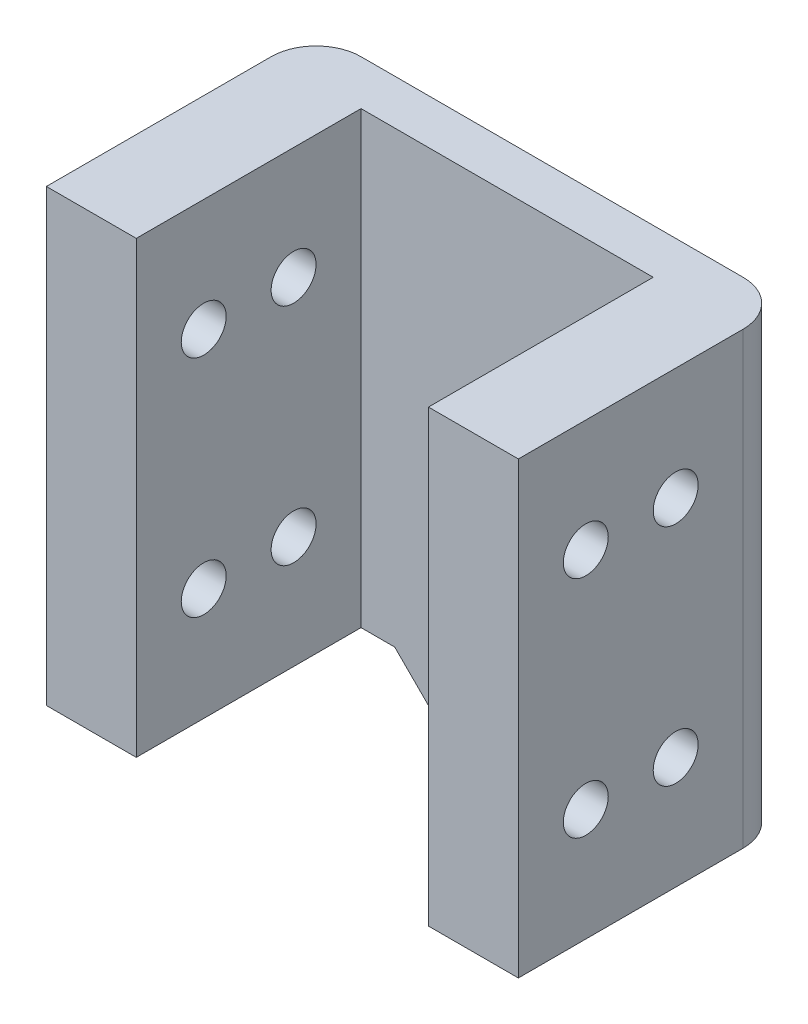
ISO-10303-21;
HEADER;
FILE_DESCRIPTION(('STEP AP214'),'2;1');
FILE_NAME('part.step','',(''),(''),'','','');
FILE_SCHEMA(('AUTOMOTIVE_DESIGN { 1 0 10303 214 1 1 1 1 }'));
ENDSEC;
DATA;
#1=APPLICATION_CONTEXT('core data for automotive mechanical design processes');
#2=APPLICATION_PROTOCOL_DEFINITION('international standard','automotive_design',2000,#1);
#3=PRODUCT_CONTEXT('',#1,'mechanical');
#4=PRODUCT('Part','Part','',(#3));
#5=PRODUCT_RELATED_PRODUCT_CATEGORY('part','',(#4));
#6=PRODUCT_DEFINITION_FORMATION('','',#4);
#7=PRODUCT_DEFINITION_CONTEXT('part definition',#1,'design');
#8=PRODUCT_DEFINITION('design','',#6,#7);
#9=PRODUCT_DEFINITION_SHAPE('','',#8);
#10=(LENGTH_UNIT() NAMED_UNIT(*) SI_UNIT(.MILLI.,.METRE.));
#11=(NAMED_UNIT(*) PLANE_ANGLE_UNIT() SI_UNIT($,.RADIAN.));
#12=(NAMED_UNIT(*) SI_UNIT($,.STERADIAN.) SOLID_ANGLE_UNIT());
#13=UNCERTAINTY_MEASURE_WITH_UNIT(LENGTH_MEASURE(1.E-05),#10,'distance_accuracy_value','');
#14=(GEOMETRIC_REPRESENTATION_CONTEXT(3) GLOBAL_UNCERTAINTY_ASSIGNED_CONTEXT((#13)) GLOBAL_UNIT_ASSIGNED_CONTEXT((#10,
#11,#12)) REPRESENTATION_CONTEXT('',''));
#15=CARTESIAN_POINT('',(0.,0.,0.));
#16=DIRECTION('',(0.,0.,1.));
#17=DIRECTION('',(1.,0.,0.));
#18=AXIS2_PLACEMENT_3D('',#15,#16,#17);
#19=CARTESIAN_POINT('',(0.,-20.,0.));
#20=DIRECTION('',(0.,1.,0.));
#21=DIRECTION('',(0.,0.,1.));
#22=AXIS2_PLACEMENT_3D('',#19,#20,#21);
#23=PLANE('',#22);
#24=DIRECTION('',(0.,0.,1.));
#25=VECTOR('',#24,1.);
#26=CARTESIAN_POINT('',(-21.,-20.,0.));
#27=LINE('',#26,#25);
#28=CARTESIAN_POINT('',(-21.,-20.,-20.));
#29=VERTEX_POINT('',#28);
#30=CARTESIAN_POINT('',(-21.,-20.,0.));
#31=VERTEX_POINT('',#30);
#32=EDGE_CURVE('E298',#29,#31,#27,.T.);
#33=ORIENTED_EDGE('',*,*,#32,.F.);
#34=CARTESIAN_POINT('',(-17.,-20.,-20.));
#35=DIRECTION('',(0.,1.,0.));
#36=DIRECTION('',(0.,0.,1.));
#37=AXIS2_PLACEMENT_3D('',#34,#35,#36);
#38=CIRCLE('',#37,4.);
#39=CARTESIAN_POINT('',(-17.,-20.,-24.));
#40=VERTEX_POINT('',#39);
#41=EDGE_CURVE('E382',#29,#40,#38,.F.);
#42=ORIENTED_EDGE('',*,*,#41,.T.);
#43=DIRECTION('',(-1.,0.,0.));
#44=VECTOR('',#43,1.);
#45=CARTESIAN_POINT('',(21.,-20.,-24.));
#46=LINE('',#45,#44);
#47=CARTESIAN_POINT('',(-9.99999999999998,-20.,-24.));
#48=VERTEX_POINT('',#47);
#49=EDGE_CURVE('E294',#48,#40,#46,.T.);
#50=ORIENTED_EDGE('',*,*,#49,.F.);
#51=DIRECTION('',(0.,0.,1.));
#52=VECTOR('',#51,1.);
#53=CARTESIAN_POINT('',(-9.99999999999998,-20.,-20.));
#54=LINE('',#53,#52);
#55=CARTESIAN_POINT('',(-9.99999999999998,-20.,-20.));
#56=VERTEX_POINT('',#55);
#57=EDGE_CURVE('E177',#48,#56,#54,.T.);
#58=ORIENTED_EDGE('',*,*,#57,.T.);
#59=DIRECTION('',(1.,0.,0.));
#60=VECTOR('',#59,1.);
#61=CARTESIAN_POINT('',(13.,-20.,-20.));
#62=LINE('',#61,#60);
#63=CARTESIAN_POINT('',(-13.,-20.,-20.));
#64=VERTEX_POINT('',#63);
#65=EDGE_CURVE('E309',#64,#56,#62,.T.);
#66=ORIENTED_EDGE('',*,*,#65,.F.);
#67=DIRECTION('',(0.,0.,-1.));
#68=VECTOR('',#67,1.);
#69=CARTESIAN_POINT('',(-13.,-20.,0.));
#70=LINE('',#69,#68);
#71=CARTESIAN_POINT('',(-13.,-20.,0.));
#72=VERTEX_POINT('',#71);
#73=EDGE_CURVE('E305',#72,#64,#70,.T.);
#74=ORIENTED_EDGE('',*,*,#73,.F.);
#75=DIRECTION('',(1.,0.,0.));
#76=VECTOR('',#75,1.);
#77=CARTESIAN_POINT('',(-13.,-20.,0.));
#78=LINE('',#77,#76);
#79=EDGE_CURVE('E302',#31,#72,#78,.T.);
#80=ORIENTED_EDGE('',*,*,#79,.F.);
#81=EDGE_LOOP('',(#33,#42,#50,#58,#66,#74,#80));
#82=FACE_BOUND('',#81,.T.);
#83=ADVANCED_FACE('F41',(#82),#23,.F.);
#84=CARTESIAN_POINT('',(17.,-20.,-24.));
#85=VERTEX_POINT('',#84);
#86=CARTESIAN_POINT('',(9.99999999999998,-20.,-24.));
#87=VERTEX_POINT('',#86);
#88=EDGE_CURVE('E295',#85,#87,#46,.T.);
#89=ORIENTED_EDGE('',*,*,#88,.F.);
#90=CARTESIAN_POINT('',(17.,-20.,-20.));
#91=DIRECTION('',(0.,1.,0.));
#92=DIRECTION('',(0.,0.,1.));
#93=AXIS2_PLACEMENT_3D('',#90,#91,#92);
#94=CIRCLE('',#93,4.);
#95=CARTESIAN_POINT('',(21.,-20.,-20.));
#96=VERTEX_POINT('',#95);
#97=EDGE_CURVE('E398',#85,#96,#94,.F.);
#98=ORIENTED_EDGE('',*,*,#97,.T.);
#99=DIRECTION('',(0.,0.,-1.));
#100=VECTOR('',#99,1.);
#101=CARTESIAN_POINT('',(21.,-20.,0.));
#102=LINE('',#101,#100);
#103=CARTESIAN_POINT('',(21.,-20.,0.));
#104=VERTEX_POINT('',#103);
#105=EDGE_CURVE('E290',#104,#96,#102,.T.);
#106=ORIENTED_EDGE('',*,*,#105,.F.);
#107=DIRECTION('',(1.,0.,0.));
#108=VECTOR('',#107,1.);
#109=CARTESIAN_POINT('',(13.,-20.,0.));
#110=LINE('',#109,#108);
#111=CARTESIAN_POINT('',(13.,-20.,0.));
#112=VERTEX_POINT('',#111);
#113=EDGE_CURVE('E257',#112,#104,#110,.T.);
#114=ORIENTED_EDGE('',*,*,#113,.F.);
#115=DIRECTION('',(0.,0.,1.));
#116=VECTOR('',#115,1.);
#117=CARTESIAN_POINT('',(13.,-20.,0.));
#118=LINE('',#117,#116);
#119=CARTESIAN_POINT('',(13.,-20.,-20.));
#120=VERTEX_POINT('',#119);
#121=EDGE_CURVE('E263',#120,#112,#118,.T.);
#122=ORIENTED_EDGE('',*,*,#121,.F.);
#123=CARTESIAN_POINT('',(9.99999999999998,-20.,-20.));
#124=VERTEX_POINT('',#123);
#125=EDGE_CURVE('E308',#124,#120,#62,.T.);
#126=ORIENTED_EDGE('',*,*,#125,.F.);
#127=DIRECTION('',(0.,0.,-1.));
#128=VECTOR('',#127,1.);
#129=CARTESIAN_POINT('',(9.99999999999998,-20.,-24.));
#130=LINE('',#129,#128);
#131=EDGE_CURVE('E171',#124,#87,#130,.T.);
#132=ORIENTED_EDGE('',*,*,#131,.T.);
#133=EDGE_LOOP('',(#89,#98,#106,#114,#122,#126,#132));
#134=FACE_BOUND('',#133,.T.);
#135=ADVANCED_FACE('F472',(#134),#23,.F.);
#136=CARTESIAN_POINT('',(13.,20.,0.));
#137=DIRECTION('',(0.,0.,-1.));
#138=DIRECTION('',(-1.,0.,0.));
#139=AXIS2_PLACEMENT_3D('',#136,#137,#138);
#140=PLANE('',#139);
#141=ORIENTED_EDGE('',*,*,#113,.T.);
#142=DIRECTION('',(0.,-1.,0.));
#143=VECTOR('',#142,1.);
#144=CARTESIAN_POINT('',(21.,20.,0.));
#145=LINE('',#144,#143);
#146=CARTESIAN_POINT('',(21.,20.,0.));
#147=VERTEX_POINT('',#146);
#148=EDGE_CURVE('E333',#147,#104,#145,.T.);
#149=ORIENTED_EDGE('',*,*,#148,.F.);
#150=DIRECTION('',(1.,0.,0.));
#151=VECTOR('',#150,1.);
#152=CARTESIAN_POINT('',(13.,20.,0.));
#153=LINE('',#152,#151);
#154=CARTESIAN_POINT('',(13.,20.,0.));
#155=VERTEX_POINT('',#154);
#156=EDGE_CURVE('E258',#155,#147,#153,.T.);
#157=ORIENTED_EDGE('',*,*,#156,.F.);
#158=DIRECTION('',(0.,-1.,0.));
#159=VECTOR('',#158,1.);
#160=CARTESIAN_POINT('',(13.,20.,0.));
#161=LINE('',#160,#159);
#162=EDGE_CURVE('E286',#155,#112,#161,.T.);
#163=ORIENTED_EDGE('',*,*,#162,.T.);
#164=EDGE_LOOP('',(#141,#149,#157,#163));
#165=FACE_BOUND('',#164,.T.);
#166=ADVANCED_FACE('F462',(#165),#140,.F.);
#167=CARTESIAN_POINT('',(21.,20.,0.));
#168=DIRECTION('',(-1.,0.,0.));
#169=DIRECTION('',(0.,0.,1.));
#170=AXIS2_PLACEMENT_3D('',#167,#168,#169);
#171=PLANE('',#170);
#172=CARTESIAN_POINT('',(21.,-10.,-6.));
#173=DIRECTION('',(1.,0.,0.));
#174=DIRECTION('',(0.,0.,1.));
#175=AXIS2_PLACEMENT_3D('',#172,#173,#174);
#176=CIRCLE('',#175,2.);
#177=CARTESIAN_POINT('',(21.,-10.,-4.));
#178=VERTEX_POINT('',#177);
#179=EDGE_CURVE('E192',#178,#178,#176,.T.);
#180=ORIENTED_EDGE('',*,*,#179,.F.);
#181=EDGE_LOOP('',(#180));
#182=FACE_BOUND('',#181,.T.);
#183=CARTESIAN_POINT('',(21.,-10.,-14.));
#184=DIRECTION('',(1.,0.,0.));
#185=DIRECTION('',(0.,0.,1.));
#186=AXIS2_PLACEMENT_3D('',#183,#184,#185);
#187=CIRCLE('',#186,2.);
#188=CARTESIAN_POINT('',(21.,-10.,-12.));
#189=VERTEX_POINT('',#188);
#190=EDGE_CURVE('E223',#189,#189,#187,.T.);
#191=ORIENTED_EDGE('',*,*,#190,.F.);
#192=EDGE_LOOP('',(#191));
#193=FACE_BOUND('',#192,.T.);
#194=CARTESIAN_POINT('',(21.,10.,-14.));
#195=DIRECTION('',(1.,0.,0.));
#196=DIRECTION('',(0.,0.,-1.));
#197=AXIS2_PLACEMENT_3D('',#194,#195,#196);
#198=CIRCLE('',#197,2.);
#199=CARTESIAN_POINT('',(21.,10.,-16.));
#200=VERTEX_POINT('',#199);
#201=EDGE_CURVE('E215',#200,#200,#198,.T.);
#202=ORIENTED_EDGE('',*,*,#201,.F.);
#203=EDGE_LOOP('',(#202));
#204=FACE_BOUND('',#203,.T.);
#205=CARTESIAN_POINT('',(21.,10.,-6.));
#206=DIRECTION('',(1.,0.,0.));
#207=DIRECTION('',(0.,0.,-1.));
#208=AXIS2_PLACEMENT_3D('',#205,#206,#207);
#209=CIRCLE('',#208,2.);
#210=CARTESIAN_POINT('',(21.,10.,-8.));
#211=VERTEX_POINT('',#210);
#212=EDGE_CURVE('E214',#211,#211,#209,.T.);
#213=ORIENTED_EDGE('',*,*,#212,.F.);
#214=EDGE_LOOP('',(#213));
#215=FACE_BOUND('',#214,.T.);
#216=ORIENTED_EDGE('',*,*,#105,.T.);
#217=DIRECTION('',(0.,-1.,0.));
#218=VECTOR('',#217,1.);
#219=CARTESIAN_POINT('',(21.,20.,-20.));
#220=LINE('',#219,#218);
#221=CARTESIAN_POINT('',(21.,20.,-20.));
#222=VERTEX_POINT('',#221);
#223=EDGE_CURVE('E401',#96,#222,#220,.F.);
#224=ORIENTED_EDGE('',*,*,#223,.T.);
#225=DIRECTION('',(0.,0.,-1.));
#226=VECTOR('',#225,1.);
#227=CARTESIAN_POINT('',(21.,20.,0.));
#228=LINE('',#227,#226);
#229=EDGE_CURVE('E262',#147,#222,#228,.T.);
#230=ORIENTED_EDGE('',*,*,#229,.F.);
#231=ORIENTED_EDGE('',*,*,#148,.T.);
#232=EDGE_LOOP('',(#216,#224,#230,#231));
#233=FACE_BOUND('',#232,.T.);
#234=ADVANCED_FACE('F465',(#182,#193,#204,#215,#233),#171,.F.);
#235=CARTESIAN_POINT('',(21.,20.,-24.));
#236=DIRECTION('',(0.,0.,1.));
#237=DIRECTION('',(1.,0.,0.));
#238=AXIS2_PLACEMENT_3D('',#235,#236,#237);
#239=PLANE('',#238);
#240=ORIENTED_EDGE('',*,*,#49,.T.);
#241=DIRECTION('',(0.,-1.,0.));
#242=VECTOR('',#241,1.);
#243=CARTESIAN_POINT('',(-17.,20.,-24.));
#244=LINE('',#243,#242);
#245=CARTESIAN_POINT('',(-17.,20.,-24.));
#246=VERTEX_POINT('',#245);
#247=EDGE_CURVE('E389',#40,#246,#244,.F.);
#248=ORIENTED_EDGE('',*,*,#247,.T.);
#249=DIRECTION('',(-1.,0.,0.));
#250=VECTOR('',#249,1.);
#251=CARTESIAN_POINT('',(21.,20.,-24.));
#252=LINE('',#251,#250);
#253=CARTESIAN_POINT('',(17.,20.,-24.));
#254=VERTEX_POINT('',#253);
#255=EDGE_CURVE('E267',#254,#246,#252,.T.);
#256=ORIENTED_EDGE('',*,*,#255,.F.);
#257=DIRECTION('',(0.,-1.,0.));
#258=VECTOR('',#257,1.);
#259=CARTESIAN_POINT('',(17.,20.,-24.));
#260=LINE('',#259,#258);
#261=EDGE_CURVE('E385',#254,#85,#260,.T.);
#262=ORIENTED_EDGE('',*,*,#261,.T.);
#263=ORIENTED_EDGE('',*,*,#88,.T.);
#264=EDGE_CURVE('E299',#87,#48,#46,.T.);
#265=ORIENTED_EDGE('',*,*,#264,.T.);
#266=EDGE_LOOP('',(#240,#248,#256,#262,#263,#265));
#267=FACE_BOUND('',#266,.T.);
#268=ADVANCED_FACE('F424',(#267),#239,.F.);
#269=CARTESIAN_POINT('',(-21.,20.,0.));
#270=DIRECTION('',(1.,0.,0.));
#271=DIRECTION('',(0.,0.,-1.));
#272=AXIS2_PLACEMENT_3D('',#269,#270,#271);
#273=PLANE('',#272);
#274=CARTESIAN_POINT('',(-21.,-10.,-6.));
#275=DIRECTION('',(1.,0.,0.));
#276=DIRECTION('',(0.,0.,1.));
#277=AXIS2_PLACEMENT_3D('',#274,#275,#276);
#278=CIRCLE('',#277,2.);
#279=CARTESIAN_POINT('',(-21.,-10.,-4.));
#280=VERTEX_POINT('',#279);
#281=EDGE_CURVE('E197',#280,#280,#278,.T.);
#282=ORIENTED_EDGE('',*,*,#281,.T.);
#283=EDGE_LOOP('',(#282));
#284=FACE_BOUND('',#283,.T.);
#285=CARTESIAN_POINT('',(-21.,-10.,-14.));
#286=DIRECTION('',(1.,0.,0.));
#287=DIRECTION('',(0.,0.,1.));
#288=AXIS2_PLACEMENT_3D('',#285,#286,#287);
#289=CIRCLE('',#288,2.);
#290=CARTESIAN_POINT('',(-21.,-10.,-12.));
#291=VERTEX_POINT('',#290);
#292=EDGE_CURVE('E219',#291,#291,#289,.T.);
#293=ORIENTED_EDGE('',*,*,#292,.T.);
#294=EDGE_LOOP('',(#293));
#295=FACE_BOUND('',#294,.T.);
#296=CARTESIAN_POINT('',(-21.,10.,-14.));
#297=DIRECTION('',(1.,0.,0.));
#298=DIRECTION('',(0.,0.,-1.));
#299=AXIS2_PLACEMENT_3D('',#296,#297,#298);
#300=CIRCLE('',#299,2.);
#301=CARTESIAN_POINT('',(-21.,10.,-16.));
#302=VERTEX_POINT('',#301);
#303=EDGE_CURVE('E210',#302,#302,#300,.T.);
#304=ORIENTED_EDGE('',*,*,#303,.T.);
#305=EDGE_LOOP('',(#304));
#306=FACE_BOUND('',#305,.T.);
#307=CARTESIAN_POINT('',(-21.,10.,-6.));
#308=DIRECTION('',(1.,0.,0.));
#309=DIRECTION('',(0.,0.,-1.));
#310=AXIS2_PLACEMENT_3D('',#307,#308,#309);
#311=CIRCLE('',#310,2.);
#312=CARTESIAN_POINT('',(-21.,10.,-8.));
#313=VERTEX_POINT('',#312);
#314=EDGE_CURVE('E230',#313,#313,#311,.T.);
#315=ORIENTED_EDGE('',*,*,#314,.T.);
#316=EDGE_LOOP('',(#315));
#317=FACE_BOUND('',#316,.T.);
#318=DIRECTION('',(0.,0.,1.));
#319=VECTOR('',#318,1.);
#320=CARTESIAN_POINT('',(-21.,20.,0.));
#321=LINE('',#320,#319);
#322=CARTESIAN_POINT('',(-21.,20.,-20.));
#323=VERTEX_POINT('',#322);
#324=CARTESIAN_POINT('',(-21.,20.,0.));
#325=VERTEX_POINT('',#324);
#326=EDGE_CURVE('E271',#323,#325,#321,.T.);
#327=ORIENTED_EDGE('',*,*,#326,.F.);
#328=DIRECTION('',(0.,-1.,0.));
#329=VECTOR('',#328,1.);
#330=CARTESIAN_POINT('',(-21.,20.,-20.));
#331=LINE('',#330,#329);
#332=EDGE_CURVE('E378',#323,#29,#331,.T.);
#333=ORIENTED_EDGE('',*,*,#332,.T.);
#334=ORIENTED_EDGE('',*,*,#32,.T.);
#335=DIRECTION('',(0.,-1.,0.));
#336=VECTOR('',#335,1.);
#337=CARTESIAN_POINT('',(-21.,20.,0.));
#338=LINE('',#337,#336);
#339=EDGE_CURVE('E329',#325,#31,#338,.T.);
#340=ORIENTED_EDGE('',*,*,#339,.F.);
#341=EDGE_LOOP('',(#327,#333,#334,#340));
#342=FACE_BOUND('',#341,.T.);
#343=ADVANCED_FACE('F438',(#284,#295,#306,#317,#342),#273,.F.);
#344=CARTESIAN_POINT('',(-13.,20.,0.));
#345=DIRECTION('',(0.,0.,-1.));
#346=DIRECTION('',(-1.,0.,0.));
#347=AXIS2_PLACEMENT_3D('',#344,#345,#346);
#348=PLANE('',#347);
#349=ORIENTED_EDGE('',*,*,#79,.T.);
#350=DIRECTION('',(0.,-1.,0.));
#351=VECTOR('',#350,1.);
#352=CARTESIAN_POINT('',(-13.,20.,0.));
#353=LINE('',#352,#351);
#354=CARTESIAN_POINT('',(-13.,20.,0.));
#355=VERTEX_POINT('',#354);
#356=EDGE_CURVE('E325',#355,#72,#353,.T.);
#357=ORIENTED_EDGE('',*,*,#356,.F.);
#358=DIRECTION('',(1.,0.,0.));
#359=VECTOR('',#358,1.);
#360=CARTESIAN_POINT('',(-13.,20.,0.));
#361=LINE('',#360,#359);
#362=EDGE_CURVE('E274',#325,#355,#361,.T.);
#363=ORIENTED_EDGE('',*,*,#362,.F.);
#364=ORIENTED_EDGE('',*,*,#339,.T.);
#365=EDGE_LOOP('',(#349,#357,#363,#364));
#366=FACE_BOUND('',#365,.T.);
#367=ADVANCED_FACE('F444',(#366),#348,.F.);
#368=CARTESIAN_POINT('',(-13.,20.,0.));
#369=DIRECTION('',(-1.,0.,0.));
#370=DIRECTION('',(0.,0.,1.));
#371=AXIS2_PLACEMENT_3D('',#368,#369,#370);
#372=PLANE('',#371);
#373=CARTESIAN_POINT('',(-13.,-10.,-6.));
#374=DIRECTION('',(-1.,0.,0.));
#375=DIRECTION('',(0.,0.,1.));
#376=AXIS2_PLACEMENT_3D('',#373,#374,#375);
#377=CIRCLE('',#376,2.);
#378=CARTESIAN_POINT('',(-13.,-10.,-4.));
#379=VERTEX_POINT('',#378);
#380=EDGE_CURVE('E253',#379,#379,#377,.T.);
#381=ORIENTED_EDGE('',*,*,#380,.T.);
#382=EDGE_LOOP('',(#381));
#383=FACE_BOUND('',#382,.T.);
#384=CARTESIAN_POINT('',(-13.,-10.,-14.));
#385=DIRECTION('',(-1.,0.,0.));
#386=DIRECTION('',(0.,0.,1.));
#387=AXIS2_PLACEMENT_3D('',#384,#385,#386);
#388=CIRCLE('',#387,2.);
#389=CARTESIAN_POINT('',(-13.,-10.,-12.));
#390=VERTEX_POINT('',#389);
#391=EDGE_CURVE('E248',#390,#390,#388,.T.);
#392=ORIENTED_EDGE('',*,*,#391,.T.);
#393=EDGE_LOOP('',(#392));
#394=FACE_BOUND('',#393,.T.);
#395=CARTESIAN_POINT('',(-13.,10.,-14.));
#396=DIRECTION('',(-1.,0.,0.));
#397=DIRECTION('',(0.,0.,1.));
#398=AXIS2_PLACEMENT_3D('',#395,#396,#397);
#399=CIRCLE('',#398,2.);
#400=CARTESIAN_POINT('',(-13.,10.,-12.));
#401=VERTEX_POINT('',#400);
#402=EDGE_CURVE('E243',#401,#401,#399,.T.);
#403=ORIENTED_EDGE('',*,*,#402,.T.);
#404=EDGE_LOOP('',(#403));
#405=FACE_BOUND('',#404,.T.);
#406=CARTESIAN_POINT('',(-13.,10.,-6.));
#407=DIRECTION('',(-1.,0.,0.));
#408=DIRECTION('',(0.,0.,1.));
#409=AXIS2_PLACEMENT_3D('',#406,#407,#408);
#410=CIRCLE('',#409,2.);
#411=CARTESIAN_POINT('',(-13.,10.,-4.));
#412=VERTEX_POINT('',#411);
#413=EDGE_CURVE('E238',#412,#412,#410,.T.);
#414=ORIENTED_EDGE('',*,*,#413,.T.);
#415=EDGE_LOOP('',(#414));
#416=FACE_BOUND('',#415,.T.);
#417=ORIENTED_EDGE('',*,*,#73,.T.);
#418=DIRECTION('',(0.,-1.,0.));
#419=VECTOR('',#418,1.);
#420=CARTESIAN_POINT('',(-13.,20.,-20.));
#421=LINE('',#420,#419);
#422=CARTESIAN_POINT('',(-13.,20.,-20.));
#423=VERTEX_POINT('',#422);
#424=EDGE_CURVE('E321',#423,#64,#421,.T.);
#425=ORIENTED_EDGE('',*,*,#424,.F.);
#426=DIRECTION('',(0.,0.,-1.));
#427=VECTOR('',#426,1.);
#428=CARTESIAN_POINT('',(-13.,20.,0.));
#429=LINE('',#428,#427);
#430=EDGE_CURVE('E277',#355,#423,#429,.T.);
#431=ORIENTED_EDGE('',*,*,#430,.F.);
#432=ORIENTED_EDGE('',*,*,#356,.T.);
#433=EDGE_LOOP('',(#417,#425,#431,#432));
#434=FACE_BOUND('',#433,.T.);
#435=ADVANCED_FACE('F450',(#383,#394,#405,#416,#434),#372,.F.);
#436=CARTESIAN_POINT('',(13.,20.,-20.));
#437=DIRECTION('',(0.,0.,-1.));
#438=DIRECTION('',(-1.,0.,0.));
#439=AXIS2_PLACEMENT_3D('',#436,#437,#438);
#440=PLANE('',#439);
#441=ORIENTED_EDGE('',*,*,#65,.T.);
#442=DIRECTION('',(-0.707106781186545,0.70710678118655,0.));
#443=VECTOR('',#442,1.);
#444=CARTESIAN_POINT('',(-18.5000000000001,-11.4999999999999,-20.));
#445=LINE('',#444,#443);
#446=CARTESIAN_POINT('',(-6.,-24.,-20.));
#447=VERTEX_POINT('',#446);
#448=EDGE_CURVE('E176',#56,#447,#445,.F.);
#449=ORIENTED_EDGE('',*,*,#448,.T.);
#450=DIRECTION('',(-1.,0.,0.));
#451=VECTOR('',#450,1.);
#452=CARTESIAN_POINT('',(6.,-24.,-20.));
#453=LINE('',#452,#451);
#454=CARTESIAN_POINT('',(6.,-24.,-20.));
#455=VERTEX_POINT('',#454);
#456=EDGE_CURVE('E182',#455,#447,#453,.T.);
#457=ORIENTED_EDGE('',*,*,#456,.F.);
#458=DIRECTION('',(-0.707106781186545,-0.70710678118655,0.));
#459=VECTOR('',#458,1.);
#460=CARTESIAN_POINT('',(31.5,1.50000000000014,-20.));
#461=LINE('',#460,#459);
#462=EDGE_CURVE('E164',#455,#124,#461,.F.);
#463=ORIENTED_EDGE('',*,*,#462,.T.);
#464=ORIENTED_EDGE('',*,*,#125,.T.);
#465=DIRECTION('',(0.,-1.,0.));
#466=VECTOR('',#465,1.);
#467=CARTESIAN_POINT('',(13.,20.,-20.));
#468=LINE('',#467,#466);
#469=CARTESIAN_POINT('',(13.,20.,-20.));
#470=VERTEX_POINT('',#469);
#471=EDGE_CURVE('E317',#470,#120,#468,.T.);
#472=ORIENTED_EDGE('',*,*,#471,.F.);
#473=DIRECTION('',(1.,0.,0.));
#474=VECTOR('',#473,1.);
#475=CARTESIAN_POINT('',(13.,20.,-20.));
#476=LINE('',#475,#474);
#477=EDGE_CURVE('E280',#423,#470,#476,.T.);
#478=ORIENTED_EDGE('',*,*,#477,.F.);
#479=ORIENTED_EDGE('',*,*,#424,.T.);
#480=EDGE_LOOP('',(#441,#449,#457,#463,#464,#472,#478,#479));
#481=FACE_BOUND('',#480,.T.);
#482=ADVANCED_FACE('F189',(#481),#440,.F.);
#483=CARTESIAN_POINT('',(13.,20.,0.));
#484=DIRECTION('',(1.,0.,0.));
#485=DIRECTION('',(0.,0.,-1.));
#486=AXIS2_PLACEMENT_3D('',#483,#484,#485);
#487=PLANE('',#486);
#488=CARTESIAN_POINT('',(13.,-10.,-6.));
#489=DIRECTION('',(1.,0.,0.));
#490=DIRECTION('',(0.,0.,-1.));
#491=AXIS2_PLACEMENT_3D('',#488,#489,#490);
#492=CIRCLE('',#491,2.);
#493=CARTESIAN_POINT('',(13.,-10.,-8.));
#494=VERTEX_POINT('',#493);
#495=EDGE_CURVE('E252',#494,#494,#492,.T.);
#496=ORIENTED_EDGE('',*,*,#495,.T.);
#497=EDGE_LOOP('',(#496));
#498=FACE_BOUND('',#497,.T.);
#499=CARTESIAN_POINT('',(13.,-10.,-14.));
#500=DIRECTION('',(1.,0.,0.));
#501=DIRECTION('',(0.,0.,-1.));
#502=AXIS2_PLACEMENT_3D('',#499,#500,#501);
#503=CIRCLE('',#502,2.);
#504=CARTESIAN_POINT('',(13.,-10.,-16.));
#505=VERTEX_POINT('',#504);
#506=EDGE_CURVE('E247',#505,#505,#503,.T.);
#507=ORIENTED_EDGE('',*,*,#506,.T.);
#508=EDGE_LOOP('',(#507));
#509=FACE_BOUND('',#508,.T.);
#510=CARTESIAN_POINT('',(13.,10.,-14.));
#511=DIRECTION('',(1.,0.,0.));
#512=DIRECTION('',(0.,0.,-1.));
#513=AXIS2_PLACEMENT_3D('',#510,#511,#512);
#514=CIRCLE('',#513,2.);
#515=CARTESIAN_POINT('',(13.,10.,-16.));
#516=VERTEX_POINT('',#515);
#517=EDGE_CURVE('E242',#516,#516,#514,.T.);
#518=ORIENTED_EDGE('',*,*,#517,.T.);
#519=EDGE_LOOP('',(#518));
#520=FACE_BOUND('',#519,.T.);
#521=CARTESIAN_POINT('',(13.,10.,-6.));
#522=DIRECTION('',(1.,0.,0.));
#523=DIRECTION('',(0.,0.,-1.));
#524=AXIS2_PLACEMENT_3D('',#521,#522,#523);
#525=CIRCLE('',#524,2.);
#526=CARTESIAN_POINT('',(13.,10.,-8.));
#527=VERTEX_POINT('',#526);
#528=EDGE_CURVE('E234',#527,#527,#525,.T.);
#529=ORIENTED_EDGE('',*,*,#528,.T.);
#530=EDGE_LOOP('',(#529));
#531=FACE_BOUND('',#530,.T.);
#532=ORIENTED_EDGE('',*,*,#121,.T.);
#533=ORIENTED_EDGE('',*,*,#162,.F.);
#534=DIRECTION('',(0.,0.,1.));
#535=VECTOR('',#534,1.);
#536=CARTESIAN_POINT('',(13.,20.,0.));
#537=LINE('',#536,#535);
#538=EDGE_CURVE('E283',#470,#155,#537,.T.);
#539=ORIENTED_EDGE('',*,*,#538,.F.);
#540=ORIENTED_EDGE('',*,*,#471,.T.);
#541=EDGE_LOOP('',(#532,#533,#539,#540));
#542=FACE_BOUND('',#541,.T.);
#543=ADVANCED_FACE('F457',(#498,#509,#520,#531,#542),#487,.F.);
#544=CARTESIAN_POINT('',(0.,20.,0.));
#545=DIRECTION('',(0.,1.,0.));
#546=DIRECTION('',(0.,0.,1.));
#547=AXIS2_PLACEMENT_3D('',#544,#545,#546);
#548=PLANE('',#547);
#549=ORIENTED_EDGE('',*,*,#255,.T.);
#550=CARTESIAN_POINT('',(-17.,20.,-20.));
#551=DIRECTION('',(0.,1.,0.));
#552=DIRECTION('',(0.,0.,1.));
#553=AXIS2_PLACEMENT_3D('',#550,#551,#552);
#554=CIRCLE('',#553,4.);
#555=EDGE_CURVE('E395',#246,#323,#554,.T.);
#556=ORIENTED_EDGE('',*,*,#555,.T.);
#557=ORIENTED_EDGE('',*,*,#326,.T.);
#558=ORIENTED_EDGE('',*,*,#362,.T.);
#559=ORIENTED_EDGE('',*,*,#430,.T.);
#560=ORIENTED_EDGE('',*,*,#477,.T.);
#561=ORIENTED_EDGE('',*,*,#538,.T.);
#562=ORIENTED_EDGE('',*,*,#156,.T.);
#563=ORIENTED_EDGE('',*,*,#229,.T.);
#564=CARTESIAN_POINT('',(17.,20.,-20.));
#565=DIRECTION('',(0.,1.,0.));
#566=DIRECTION('',(0.,0.,1.));
#567=AXIS2_PLACEMENT_3D('',#564,#565,#566);
#568=CIRCLE('',#567,4.);
#569=EDGE_CURVE('E392',#222,#254,#568,.T.);
#570=ORIENTED_EDGE('',*,*,#569,.T.);
#571=EDGE_LOOP('',(#549,#556,#557,#558,#559,#560,#561,#562,#563,#570));
#572=FACE_BOUND('',#571,.T.);
#573=ADVANCED_FACE('F435',(#572),#548,.T.);
#574=CARTESIAN_POINT('',(-21.,10.,-6.));
#575=DIRECTION('',(1.,0.,0.));
#576=DIRECTION('',(0.,0.,-1.));
#577=AXIS2_PLACEMENT_3D('',#574,#575,#576);
#578=CYLINDRICAL_SURFACE('',#577,2.);
#579=ORIENTED_EDGE('',*,*,#212,.T.);
#580=EDGE_LOOP('',(#579));
#581=FACE_BOUND('',#580,.T.);
#582=ORIENTED_EDGE('',*,*,#528,.F.);
#583=EDGE_LOOP('',(#582));
#584=FACE_BOUND('',#583,.T.);
#585=ADVANCED_FACE('F600',(#581,#584),#578,.F.);
#586=CARTESIAN_POINT('',(-21.,10.,-14.));
#587=DIRECTION('',(1.,0.,0.));
#588=DIRECTION('',(0.,0.,-1.));
#589=AXIS2_PLACEMENT_3D('',#586,#587,#588);
#590=CYLINDRICAL_SURFACE('',#589,2.);
#591=ORIENTED_EDGE('',*,*,#201,.T.);
#592=EDGE_LOOP('',(#591));
#593=FACE_BOUND('',#592,.T.);
#594=ORIENTED_EDGE('',*,*,#517,.F.);
#595=EDGE_LOOP('',(#594));
#596=FACE_BOUND('',#595,.T.);
#597=ADVANCED_FACE('F594',(#593,#596),#590,.F.);
#598=CARTESIAN_POINT('',(-21.,-10.,-14.));
#599=DIRECTION('',(1.,0.,0.));
#600=DIRECTION('',(0.,0.,-1.));
#601=AXIS2_PLACEMENT_3D('',#598,#599,#600);
#602=CYLINDRICAL_SURFACE('',#601,2.);
#603=ORIENTED_EDGE('',*,*,#190,.T.);
#604=EDGE_LOOP('',(#603));
#605=FACE_BOUND('',#604,.T.);
#606=ORIENTED_EDGE('',*,*,#506,.F.);
#607=EDGE_LOOP('',(#606));
#608=FACE_BOUND('',#607,.T.);
#609=ADVANCED_FACE('F597',(#605,#608),#602,.F.);
#610=CARTESIAN_POINT('',(-21.,-10.,-6.));
#611=DIRECTION('',(1.,0.,0.));
#612=DIRECTION('',(0.,0.,-1.));
#613=AXIS2_PLACEMENT_3D('',#610,#611,#612);
#614=CYLINDRICAL_SURFACE('',#613,2.);
#615=ORIENTED_EDGE('',*,*,#179,.T.);
#616=EDGE_LOOP('',(#615));
#617=FACE_BOUND('',#616,.T.);
#618=ORIENTED_EDGE('',*,*,#495,.F.);
#619=EDGE_LOOP('',(#618));
#620=FACE_BOUND('',#619,.T.);
#621=ADVANCED_FACE('F580',(#617,#620),#614,.F.);
#622=ORIENTED_EDGE('',*,*,#314,.F.);
#623=EDGE_LOOP('',(#622));
#624=FACE_BOUND('',#623,.T.);
#625=ORIENTED_EDGE('',*,*,#413,.F.);
#626=EDGE_LOOP('',(#625));
#627=FACE_BOUND('',#626,.T.);
#628=ADVANCED_FACE('F592',(#624,#627),#578,.F.);
#629=ORIENTED_EDGE('',*,*,#303,.F.);
#630=EDGE_LOOP('',(#629));
#631=FACE_BOUND('',#630,.T.);
#632=ORIENTED_EDGE('',*,*,#402,.F.);
#633=EDGE_LOOP('',(#632));
#634=FACE_BOUND('',#633,.T.);
#635=ADVANCED_FACE('F589',(#631,#634),#590,.F.);
#636=ORIENTED_EDGE('',*,*,#292,.F.);
#637=EDGE_LOOP('',(#636));
#638=FACE_BOUND('',#637,.T.);
#639=ORIENTED_EDGE('',*,*,#391,.F.);
#640=EDGE_LOOP('',(#639));
#641=FACE_BOUND('',#640,.T.);
#642=ADVANCED_FACE('F577',(#638,#641),#602,.F.);
#643=ORIENTED_EDGE('',*,*,#281,.F.);
#644=EDGE_LOOP('',(#643));
#645=FACE_BOUND('',#644,.T.);
#646=ORIENTED_EDGE('',*,*,#380,.F.);
#647=EDGE_LOOP('',(#646));
#648=FACE_BOUND('',#647,.T.);
#649=ADVANCED_FACE('F570',(#645,#648),#614,.F.);
#650=CARTESIAN_POINT('',(0.,-24.,0.));
#651=DIRECTION('',(0.,-1.,0.));
#652=DIRECTION('',(0.,0.,-1.));
#653=AXIS2_PLACEMENT_3D('',#650,#651,#652);
#654=PLANE('',#653);
#655=DIRECTION('',(0.,0.,-1.));
#656=VECTOR('',#655,1.);
#657=CARTESIAN_POINT('',(-6.,-24.,-20.));
#658=LINE('',#657,#656);
#659=CARTESIAN_POINT('',(-6.,-24.,-28.0000000000001));
#660=VERTEX_POINT('',#659);
#661=CARTESIAN_POINT('',(-6.,-24.,-30.));
#662=VERTEX_POINT('',#661);
#663=EDGE_CURVE('E209',#660,#662,#658,.T.);
#664=ORIENTED_EDGE('',*,*,#663,.T.);
#665=CARTESIAN_POINT('',(0.,-24.,-30.));
#666=DIRECTION('',(0.,-1.,0.));
#667=DIRECTION('',(0.,0.,-1.));
#668=AXIS2_PLACEMENT_3D('',#665,#666,#667);
#669=CIRCLE('',#668,6.);
#670=CARTESIAN_POINT('',(0.,-24.,-36.));
#671=VERTEX_POINT('',#670);
#672=EDGE_CURVE('E51',#662,#671,#669,.T.);
#673=ORIENTED_EDGE('',*,*,#672,.T.);
#674=CARTESIAN_POINT('',(0.,-24.,-30.));
#675=DIRECTION('',(0.,-1.,0.));
#676=DIRECTION('',(0.,0.,-1.));
#677=AXIS2_PLACEMENT_3D('',#674,#675,#676);
#678=CIRCLE('',#677,6.);
#679=CARTESIAN_POINT('',(6.,-24.,-30.));
#680=VERTEX_POINT('',#679);
#681=EDGE_CURVE('E58',#671,#680,#678,.T.);
#682=ORIENTED_EDGE('',*,*,#681,.T.);
#683=DIRECTION('',(0.,0.,1.));
#684=VECTOR('',#683,1.);
#685=CARTESIAN_POINT('',(6.,-24.,-20.));
#686=LINE('',#685,#684);
#687=CARTESIAN_POINT('',(6.,-24.,-28.0000000000001));
#688=VERTEX_POINT('',#687);
#689=EDGE_CURVE('E184',#680,#688,#686,.T.);
#690=ORIENTED_EDGE('',*,*,#689,.T.);
#691=EDGE_CURVE('E168',#688,#455,#686,.T.);
#692=ORIENTED_EDGE('',*,*,#691,.T.);
#693=ORIENTED_EDGE('',*,*,#456,.T.);
#694=EDGE_CURVE('E186',#447,#660,#658,.T.);
#695=ORIENTED_EDGE('',*,*,#694,.T.);
#696=EDGE_LOOP('',(#664,#673,#682,#690,#692,#693,#695));
#697=FACE_BOUND('',#696,.T.);
#698=CARTESIAN_POINT('',(0.,-24.,-30.));
#699=DIRECTION('',(0.,-1.,0.));
#700=DIRECTION('',(0.,0.,-1.));
#701=AXIS2_PLACEMENT_3D('',#698,#699,#700);
#702=CIRCLE('',#701,3.15);
#703=CARTESIAN_POINT('',(0.,-24.,-33.15));
#704=VERTEX_POINT('',#703);
#705=EDGE_CURVE('E206',#704,#704,#702,.T.);
#706=ORIENTED_EDGE('',*,*,#705,.F.);
#707=EDGE_LOOP('',(#706));
#708=FACE_BOUND('',#707,.T.);
#709=ADVANCED_FACE('F180',(#697,#708),#654,.T.);
#710=CARTESIAN_POINT('',(0.,-20.,0.));
#711=DIRECTION('',(0.,-1.,0.));
#712=DIRECTION('',(0.,0.,-1.));
#713=AXIS2_PLACEMENT_3D('',#710,#711,#712);
#714=PLANE('',#713);
#715=CARTESIAN_POINT('',(0.,-20.,-30.));
#716=DIRECTION('',(0.,-1.,0.));
#717=DIRECTION('',(0.,0.,-1.));
#718=AXIS2_PLACEMENT_3D('',#715,#716,#717);
#719=CIRCLE('',#718,6.);
#720=CARTESIAN_POINT('',(6.,-20.,-30.));
#721=VERTEX_POINT('',#720);
#722=CARTESIAN_POINT('',(0.,-20.,-36.));
#723=VERTEX_POINT('',#722);
#724=EDGE_CURVE('E404',#721,#723,#719,.F.);
#725=ORIENTED_EDGE('',*,*,#724,.T.);
#726=CARTESIAN_POINT('',(0.,-20.,-30.));
#727=DIRECTION('',(0.,-1.,0.));
#728=DIRECTION('',(0.,0.,-1.));
#729=AXIS2_PLACEMENT_3D('',#726,#727,#728);
#730=CIRCLE('',#729,6.);
#731=CARTESIAN_POINT('',(-6.,-20.,-30.));
#732=VERTEX_POINT('',#731);
#733=EDGE_CURVE('E407',#723,#732,#730,.F.);
#734=ORIENTED_EDGE('',*,*,#733,.T.);
#735=DIRECTION('',(0.,0.,-1.));
#736=VECTOR('',#735,1.);
#737=CARTESIAN_POINT('',(-6.,-20.,-20.));
#738=LINE('',#737,#736);
#739=CARTESIAN_POINT('',(-6.,-20.,-28.0000000000001));
#740=VERTEX_POINT('',#739);
#741=EDGE_CURVE('E201',#740,#732,#738,.T.);
#742=ORIENTED_EDGE('',*,*,#741,.F.);
#743=DIRECTION('',(0.707106781186544,0.,-0.707106781186551));
#744=VECTOR('',#743,1.);
#745=CARTESIAN_POINT('',(-17.0000000000001,-20.,-16.9999999999999));
#746=LINE('',#745,#744);
#747=EDGE_CURVE('E370',#740,#48,#746,.F.);
#748=ORIENTED_EDGE('',*,*,#747,.T.);
#749=ORIENTED_EDGE('',*,*,#264,.F.);
#750=DIRECTION('',(0.707106781186544,0.,0.707106781186551));
#751=VECTOR('',#750,1.);
#752=CARTESIAN_POINT('',(17.0000000000001,-20.,-16.9999999999999));
#753=LINE('',#752,#751);
#754=CARTESIAN_POINT('',(6.,-20.,-28.0000000000001));
#755=VERTEX_POINT('',#754);
#756=EDGE_CURVE('E366',#87,#755,#753,.F.);
#757=ORIENTED_EDGE('',*,*,#756,.T.);
#758=DIRECTION('',(0.,0.,1.));
#759=VECTOR('',#758,1.);
#760=CARTESIAN_POINT('',(6.,-20.,-20.));
#761=LINE('',#760,#759);
#762=EDGE_CURVE('E205',#721,#755,#761,.T.);
#763=ORIENTED_EDGE('',*,*,#762,.F.);
#764=EDGE_LOOP('',(#725,#734,#742,#748,#749,#757,#763));
#765=FACE_BOUND('',#764,.T.);
#766=CARTESIAN_POINT('',(0.,-20.,-30.));
#767=DIRECTION('',(0.,-1.,0.));
#768=DIRECTION('',(0.,0.,-1.));
#769=AXIS2_PLACEMENT_3D('',#766,#767,#768);
#770=CIRCLE('',#769,3.15);
#771=CARTESIAN_POINT('',(0.,-20.,-33.15));
#772=VERTEX_POINT('',#771);
#773=EDGE_CURVE('E557',#772,#772,#770,.T.);
#774=ORIENTED_EDGE('',*,*,#773,.T.);
#775=EDGE_LOOP('',(#774));
#776=FACE_BOUND('',#775,.T.);
#777=ADVANCED_FACE('F479',(#765,#776),#714,.F.);
#778=CARTESIAN_POINT('',(-6.,-24.,-20.));
#779=DIRECTION('',(1.,0.,0.));
#780=DIRECTION('',(0.,0.,-1.));
#781=AXIS2_PLACEMENT_3D('',#778,#779,#780);
#782=PLANE('',#781);
#783=ORIENTED_EDGE('',*,*,#741,.T.);
#784=DIRECTION('',(0.,1.,0.));
#785=VECTOR('',#784,1.);
#786=CARTESIAN_POINT('',(-6.,-24.,-30.));
#787=LINE('',#786,#785);
#788=EDGE_CURVE('E410',#732,#662,#787,.F.);
#789=ORIENTED_EDGE('',*,*,#788,.T.);
#790=ORIENTED_EDGE('',*,*,#663,.F.);
#791=DIRECTION('',(0.,1.,0.));
#792=VECTOR('',#791,1.);
#793=CARTESIAN_POINT('',(-6.,-20.,-28.0000000000001));
#794=LINE('',#793,#792);
#795=EDGE_CURVE('E359',#660,#740,#794,.T.);
#796=ORIENTED_EDGE('',*,*,#795,.T.);
#797=EDGE_LOOP('',(#783,#789,#790,#796));
#798=FACE_BOUND('',#797,.T.);
#799=ADVANCED_FACE('F489',(#798),#782,.F.);
#800=CARTESIAN_POINT('',(6.,-24.,-20.));
#801=DIRECTION('',(-1.,0.,0.));
#802=DIRECTION('',(0.,0.,1.));
#803=AXIS2_PLACEMENT_3D('',#800,#801,#802);
#804=PLANE('',#803);
#805=ORIENTED_EDGE('',*,*,#689,.F.);
#806=DIRECTION('',(0.,1.,0.));
#807=VECTOR('',#806,1.);
#808=CARTESIAN_POINT('',(6.,-24.,-30.));
#809=LINE('',#808,#807);
#810=EDGE_CURVE('E11',#680,#721,#809,.T.);
#811=ORIENTED_EDGE('',*,*,#810,.T.);
#812=ORIENTED_EDGE('',*,*,#762,.T.);
#813=DIRECTION('',(0.,-1.,0.));
#814=VECTOR('',#813,1.);
#815=CARTESIAN_POINT('',(6.,-24.,-28.0000000000001));
#816=LINE('',#815,#814);
#817=EDGE_CURVE('E355',#755,#688,#816,.T.);
#818=ORIENTED_EDGE('',*,*,#817,.T.);
#819=EDGE_LOOP('',(#805,#811,#812,#818));
#820=FACE_BOUND('',#819,.T.);
#821=ADVANCED_FACE('F583',(#820),#804,.F.);
#822=CARTESIAN_POINT('',(0.,-24.,-30.));
#823=DIRECTION('',(0.,1.,0.));
#824=DIRECTION('',(0.,0.,1.));
#825=AXIS2_PLACEMENT_3D('',#822,#823,#824);
#826=CYLINDRICAL_SURFACE('',#825,3.15);
#827=ORIENTED_EDGE('',*,*,#705,.T.);
#828=EDGE_LOOP('',(#827));
#829=FACE_BOUND('',#828,.T.);
#830=ORIENTED_EDGE('',*,*,#773,.F.);
#831=EDGE_LOOP('',(#830));
#832=FACE_BOUND('',#831,.T.);
#833=ADVANCED_FACE('F528',(#829,#832),#826,.F.);
#834=CARTESIAN_POINT('',(6.,-24.,-20.));
#835=DIRECTION('',(0.70710678118655,-0.707106781186545,0.));
#836=DIRECTION('',(0.,0.,-1.));
#837=AXIS2_PLACEMENT_3D('',#834,#835,#836);
#838=PLANE('',#837);
#839=ORIENTED_EDGE('',*,*,#691,.F.);
#840=DIRECTION('',(0.577350269189623,0.577350269189626,0.577350269189629));
#841=VECTOR('',#840,1.);
#842=CARTESIAN_POINT('',(8.66666666666669,-21.3333333333333,-25.3333333333334));
#843=LINE('',#842,#841);
#844=EDGE_CURVE('E363',#688,#87,#843,.T.);
#845=ORIENTED_EDGE('',*,*,#844,.T.);
#846=ORIENTED_EDGE('',*,*,#131,.F.);
#847=ORIENTED_EDGE('',*,*,#462,.F.);
#848=EDGE_LOOP('',(#839,#845,#846,#847));
#849=FACE_BOUND('',#848,.T.);
#850=ADVANCED_FACE('F166',(#849),#838,.T.);
#851=CARTESIAN_POINT('',(-6.,-24.,-20.));
#852=DIRECTION('',(-0.70710678118655,-0.707106781186545,0.));
#853=DIRECTION('',(0.,0.,1.));
#854=AXIS2_PLACEMENT_3D('',#851,#852,#853);
#855=PLANE('',#854);
#856=ORIENTED_EDGE('',*,*,#448,.F.);
#857=ORIENTED_EDGE('',*,*,#57,.F.);
#858=DIRECTION('',(0.577350269189623,-0.577350269189626,-0.577350269189629));
#859=VECTOR('',#858,1.);
#860=CARTESIAN_POINT('',(-8.66666666666669,-21.3333333333333,-25.3333333333334));
#861=LINE('',#860,#859);
#862=EDGE_CURVE('E374',#48,#660,#861,.T.);
#863=ORIENTED_EDGE('',*,*,#862,.T.);
#864=ORIENTED_EDGE('',*,*,#694,.F.);
#865=EDGE_LOOP('',(#856,#857,#863,#864));
#866=FACE_BOUND('',#865,.T.);
#867=ADVANCED_FACE('F493',(#866),#855,.T.);
#868=CARTESIAN_POINT('',(6.,-24.,-28.0000000000001));
#869=DIRECTION('',(0.707106781186551,0.,-0.707106781186544));
#870=DIRECTION('',(0.,1.,0.));
#871=AXIS2_PLACEMENT_3D('',#868,#869,#870);
#872=PLANE('',#871);
#873=ORIENTED_EDGE('',*,*,#817,.F.);
#874=ORIENTED_EDGE('',*,*,#756,.F.);
#875=ORIENTED_EDGE('',*,*,#844,.F.);
#876=EDGE_LOOP('',(#873,#874,#875));
#877=FACE_BOUND('',#876,.T.);
#878=ADVANCED_FACE('F476',(#877),#872,.T.);
#879=CARTESIAN_POINT('',(-6.,-24.,-28.0000000000001));
#880=DIRECTION('',(-0.707106781186551,0.,-0.707106781186544));
#881=DIRECTION('',(0.,-1.,0.));
#882=AXIS2_PLACEMENT_3D('',#879,#880,#881);
#883=PLANE('',#882);
#884=ORIENTED_EDGE('',*,*,#795,.F.);
#885=ORIENTED_EDGE('',*,*,#862,.F.);
#886=ORIENTED_EDGE('',*,*,#747,.F.);
#887=EDGE_LOOP('',(#884,#885,#886));
#888=FACE_BOUND('',#887,.T.);
#889=ADVANCED_FACE('F486',(#888),#883,.T.);
#890=CARTESIAN_POINT('',(-17.,20.,-20.));
#891=DIRECTION('',(0.,-1.,0.));
#892=DIRECTION('',(0.,0.,-1.));
#893=AXIS2_PLACEMENT_3D('',#890,#891,#892);
#894=CYLINDRICAL_SURFACE('',#893,4.);
#895=ORIENTED_EDGE('',*,*,#555,.F.);
#896=ORIENTED_EDGE('',*,*,#247,.F.);
#897=ORIENTED_EDGE('',*,*,#41,.F.);
#898=ORIENTED_EDGE('',*,*,#332,.F.);
#899=EDGE_LOOP('',(#895,#896,#897,#898));
#900=FACE_BOUND('',#899,.T.);
#901=ADVANCED_FACE('F431',(#900),#894,.T.);
#902=CARTESIAN_POINT('',(17.,20.,-20.));
#903=DIRECTION('',(0.,-1.,0.));
#904=DIRECTION('',(0.,0.,-1.));
#905=AXIS2_PLACEMENT_3D('',#902,#903,#904);
#906=CYLINDRICAL_SURFACE('',#905,4.);
#907=ORIENTED_EDGE('',*,*,#569,.F.);
#908=ORIENTED_EDGE('',*,*,#223,.F.);
#909=ORIENTED_EDGE('',*,*,#97,.F.);
#910=ORIENTED_EDGE('',*,*,#261,.F.);
#911=EDGE_LOOP('',(#907,#908,#909,#910));
#912=FACE_BOUND('',#911,.T.);
#913=ADVANCED_FACE('F468',(#912),#906,.T.);
#914=CARTESIAN_POINT('',(0.,-24.,-30.));
#915=DIRECTION('',(0.,1.,0.));
#916=DIRECTION('',(0.,0.,1.));
#917=AXIS2_PLACEMENT_3D('',#914,#915,#916);
#918=CYLINDRICAL_SURFACE('',#917,6.);
#919=ORIENTED_EDGE('',*,*,#810,.F.);
#920=ORIENTED_EDGE('',*,*,#681,.F.);
#921=DIRECTION('',(0.,1.,0.));
#922=VECTOR('',#921,1.);
#923=CARTESIAN_POINT('',(0.,-24.,-36.));
#924=LINE('',#923,#922);
#925=EDGE_CURVE('E45',#723,#671,#924,.F.);
#926=ORIENTED_EDGE('',*,*,#925,.F.);
#927=ORIENTED_EDGE('',*,*,#724,.F.);
#928=EDGE_LOOP('',(#919,#920,#926,#927));
#929=FACE_BOUND('',#928,.T.);
#930=ADVANCED_FACE('F43',(#929),#918,.T.);
#931=CARTESIAN_POINT('',(0.,-24.,-30.));
#932=DIRECTION('',(0.,1.,0.));
#933=DIRECTION('',(0.,0.,1.));
#934=AXIS2_PLACEMENT_3D('',#931,#932,#933);
#935=CYLINDRICAL_SURFACE('',#934,6.);
#936=ORIENTED_EDGE('',*,*,#672,.F.);
#937=ORIENTED_EDGE('',*,*,#788,.F.);
#938=ORIENTED_EDGE('',*,*,#733,.F.);
#939=ORIENTED_EDGE('',*,*,#925,.T.);
#940=EDGE_LOOP('',(#936,#937,#938,#939));
#941=FACE_BOUND('',#940,.T.);
#942=ADVANCED_FACE('F546',(#941),#935,.T.);
#943=CLOSED_SHELL('',(#83,#135,#166,#234,#268,#343,#367,#435,#482,#543,#573,#585,#597,#609,#621,
#628,#635,#642,#649,#709,#777,#799,#821,#833,#850,#867,#878,#889,#901,#913,#930,#942));
#944=MANIFOLD_SOLID_BREP('B2',#943);
#945=ADVANCED_BREP_SHAPE_REPRESENTATION('',(#18,#944),#14);
#946=SHAPE_DEFINITION_REPRESENTATION(#9,#945);
ENDSEC;
END-ISO-10303-21;
